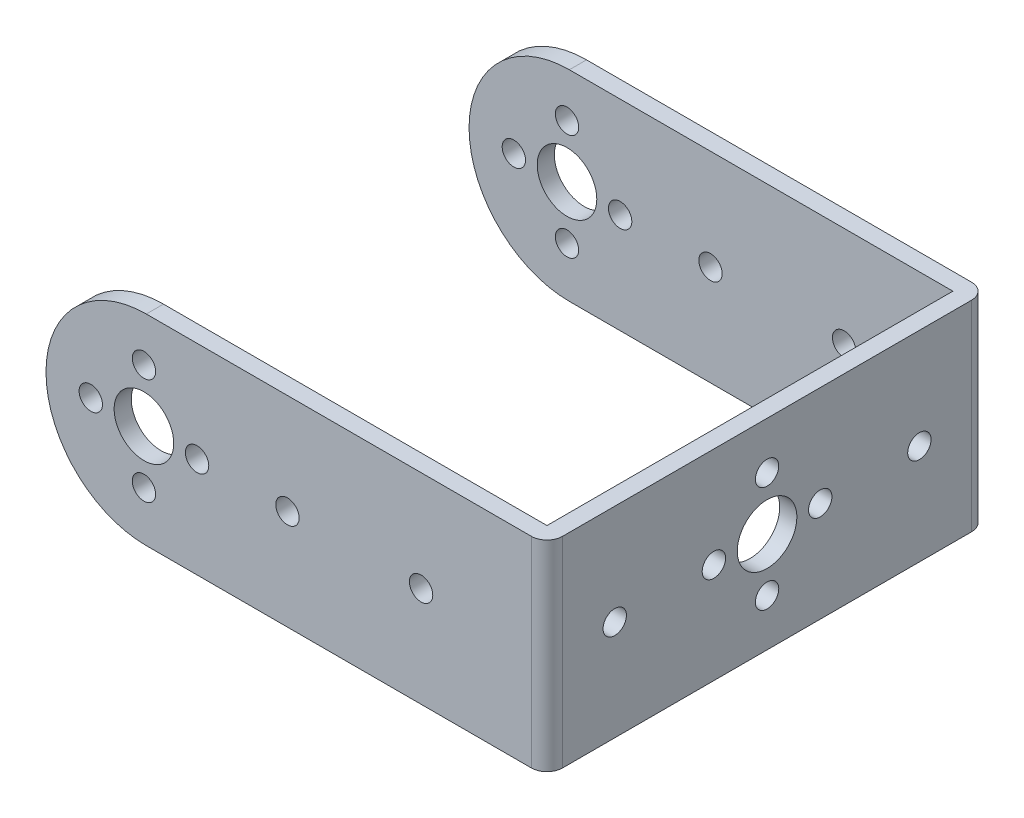
ISO-10303-21;
HEADER;
FILE_DESCRIPTION(('STEP AP214'),'2;1');
FILE_NAME('part.step','',(''),(''),'','','');
FILE_SCHEMA(('AUTOMOTIVE_DESIGN { 1 0 10303 214 1 1 1 1 }'));
ENDSEC;
DATA;
#1=APPLICATION_CONTEXT('core data for automotive mechanical design processes');
#2=APPLICATION_PROTOCOL_DEFINITION('international standard','automotive_design',2000,#1);
#3=PRODUCT_CONTEXT('',#1,'mechanical');
#4=PRODUCT('Part','Part','',(#3));
#5=PRODUCT_RELATED_PRODUCT_CATEGORY('part','',(#4));
#6=PRODUCT_DEFINITION_FORMATION('','',#4);
#7=PRODUCT_DEFINITION_CONTEXT('part definition',#1,'design');
#8=PRODUCT_DEFINITION('design','',#6,#7);
#9=PRODUCT_DEFINITION_SHAPE('','',#8);
#10=(LENGTH_UNIT() NAMED_UNIT(*) SI_UNIT(.MILLI.,.METRE.));
#11=(NAMED_UNIT(*) PLANE_ANGLE_UNIT() SI_UNIT($,.RADIAN.));
#12=(NAMED_UNIT(*) SI_UNIT($,.STERADIAN.) SOLID_ANGLE_UNIT());
#13=UNCERTAINTY_MEASURE_WITH_UNIT(LENGTH_MEASURE(1.E-05),#10,'distance_accuracy_value','');
#14=(GEOMETRIC_REPRESENTATION_CONTEXT(3) GLOBAL_UNCERTAINTY_ASSIGNED_CONTEXT((#13)) GLOBAL_UNIT_ASSIGNED_CONTEXT((#10,
#11,#12)) REPRESENTATION_CONTEXT('',''));
#15=CARTESIAN_POINT('',(0.,0.,0.));
#16=DIRECTION('',(0.,0.,1.));
#17=DIRECTION('',(1.,0.,0.));
#18=AXIS2_PLACEMENT_3D('',#15,#16,#17);
#19=CARTESIAN_POINT('',(32.15,12.875,0.));
#20=DIRECTION('',(0.,0.,1.));
#21=DIRECTION('',(1.,0.,0.));
#22=AXIS2_PLACEMENT_3D('',#19,#20,#21);
#23=PLANE('',#22);
#24=CARTESIAN_POINT('',(12.5704196521559,13.1250015369662,0.));
#25=DIRECTION('',(0.,0.,-1.));
#26=DIRECTION('',(-1.,0.,0.));
#27=AXIS2_PLACEMENT_3D('',#24,#25,#26);
#28=CIRCLE('',#27,3.825);
#29=CARTESIAN_POINT('',(16.3954196521559,13.1250015369662,0.));
#30=VERTEX_POINT('',#29);
#31=EDGE_CURVE('E386',#30,#30,#28,.T.);
#32=ORIENTED_EDGE('',*,*,#31,.F.);
#33=EDGE_LOOP('',(#32));
#34=FACE_BOUND('',#33,.T.);
#35=CARTESIAN_POINT('',(12.575,19.95,0.));
#36=DIRECTION('',(0.,0.,-1.));
#37=DIRECTION('',(-1.,0.,0.));
#38=AXIS2_PLACEMENT_3D('',#35,#36,#37);
#39=CIRCLE('',#38,1.5);
#40=CARTESIAN_POINT('',(14.075,19.95,0.));
#41=VERTEX_POINT('',#40);
#42=EDGE_CURVE('E488',#41,#41,#39,.T.);
#43=ORIENTED_EDGE('',*,*,#42,.F.);
#44=EDGE_LOOP('',(#43));
#45=FACE_BOUND('',#44,.T.);
#46=CARTESIAN_POINT('',(5.75,12.875,0.));
#47=DIRECTION('',(0.,0.,-1.));
#48=DIRECTION('',(-1.,0.,0.));
#49=AXIS2_PLACEMENT_3D('',#46,#47,#48);
#50=CIRCLE('',#49,1.5);
#51=CARTESIAN_POINT('',(7.25,12.875,0.));
#52=VERTEX_POINT('',#51);
#53=EDGE_CURVE('E311',#52,#52,#50,.T.);
#54=ORIENTED_EDGE('',*,*,#53,.F.);
#55=EDGE_LOOP('',(#54));
#56=FACE_BOUND('',#55,.T.);
#57=CARTESIAN_POINT('',(12.5704196521559,6.30000153696623,0.));
#58=DIRECTION('',(0.,0.,-1.));
#59=DIRECTION('',(-1.,0.,0.));
#60=AXIS2_PLACEMENT_3D('',#57,#58,#59);
#61=CIRCLE('',#60,1.5);
#62=CARTESIAN_POINT('',(14.0704196521559,6.30000153696623,0.));
#63=VERTEX_POINT('',#62);
#64=EDGE_CURVE('E338',#63,#63,#61,.T.);
#65=ORIENTED_EDGE('',*,*,#64,.F.);
#66=EDGE_LOOP('',(#65));
#67=FACE_BOUND('',#66,.T.);
#68=CARTESIAN_POINT('',(48.1408393043118,12.875,0.));
#69=DIRECTION('',(0.,0.,-1.));
#70=DIRECTION('',(-1.,0.,0.));
#71=AXIS2_PLACEMENT_3D('',#68,#69,#70);
#72=CIRCLE('',#71,1.5);
#73=CARTESIAN_POINT('',(49.6408393043118,12.875,0.));
#74=VERTEX_POINT('',#73);
#75=EDGE_CURVE('E337',#74,#74,#72,.T.);
#76=ORIENTED_EDGE('',*,*,#75,.F.);
#77=EDGE_LOOP('',(#76));
#78=FACE_BOUND('',#77,.T.);
#79=CARTESIAN_POINT('',(30.9908393043118,12.875,0.));
#80=DIRECTION('',(0.,0.,-1.));
#81=DIRECTION('',(-1.,0.,0.));
#82=AXIS2_PLACEMENT_3D('',#79,#80,#81);
#83=CIRCLE('',#82,1.5);
#84=CARTESIAN_POINT('',(32.4908393043118,12.875,0.));
#85=VERTEX_POINT('',#84);
#86=EDGE_CURVE('E432',#85,#85,#83,.T.);
#87=ORIENTED_EDGE('',*,*,#86,.F.);
#88=EDGE_LOOP('',(#87));
#89=FACE_BOUND('',#88,.T.);
#90=CARTESIAN_POINT('',(19.3908393043118,12.875,0.));
#91=DIRECTION('',(0.,0.,-1.));
#92=DIRECTION('',(-1.,0.,0.));
#93=AXIS2_PLACEMENT_3D('',#90,#91,#92);
#94=CIRCLE('',#93,1.5);
#95=CARTESIAN_POINT('',(20.8908393043118,12.875,0.));
#96=VERTEX_POINT('',#95);
#97=EDGE_CURVE('E323',#96,#96,#94,.T.);
#98=ORIENTED_EDGE('',*,*,#97,.F.);
#99=EDGE_LOOP('',(#98));
#100=FACE_BOUND('',#99,.T.);
#101=DIRECTION('',(0.,1.,0.));
#102=VECTOR('',#101,1.);
#103=CARTESIAN_POINT('',(62.3,6.4375,0.));
#104=LINE('',#103,#102);
#105=CARTESIAN_POINT('',(62.3,0.,0.));
#106=VERTEX_POINT('',#105);
#107=CARTESIAN_POINT('',(62.3,25.75,0.));
#108=VERTEX_POINT('',#107);
#109=EDGE_CURVE('E347',#106,#108,#104,.T.);
#110=ORIENTED_EDGE('',*,*,#109,.F.);
#111=DIRECTION('',(1.,0.,0.));
#112=VECTOR('',#111,1.);
#113=CARTESIAN_POINT('',(12.875,0.,0.));
#114=LINE('',#113,#112);
#115=CARTESIAN_POINT('',(12.875,0.,0.));
#116=VERTEX_POINT('',#115);
#117=EDGE_CURVE('E27',#116,#106,#114,.T.);
#118=ORIENTED_EDGE('',*,*,#117,.F.);
#119=CARTESIAN_POINT('',(12.875,12.875,0.));
#120=DIRECTION('',(0.,0.,1.));
#121=DIRECTION('',(0.,1.,0.));
#122=AXIS2_PLACEMENT_3D('',#119,#120,#121);
#123=CIRCLE('',#122,12.875);
#124=CARTESIAN_POINT('',(12.875,25.75,0.));
#125=VERTEX_POINT('',#124);
#126=EDGE_CURVE('E10',#125,#116,#123,.T.);
#127=ORIENTED_EDGE('',*,*,#126,.F.);
#128=DIRECTION('',(-1.,0.,0.));
#129=VECTOR('',#128,1.);
#130=CARTESIAN_POINT('',(64.3,25.75,0.));
#131=LINE('',#130,#129);
#132=EDGE_CURVE('E437',#108,#125,#131,.T.);
#133=ORIENTED_EDGE('',*,*,#132,.F.);
#134=EDGE_LOOP('',(#110,#118,#127,#133));
#135=FACE_BOUND('',#134,.T.);
#136=ADVANCED_FACE('F16',(#34,#45,#56,#67,#78,#89,#100,#135),#23,.F.);
#137=CARTESIAN_POINT('',(12.875,12.875,0.));
#138=DIRECTION('',(0.,0.,1.));
#139=DIRECTION('',(0.,1.,0.));
#140=AXIS2_PLACEMENT_3D('',#137,#138,#139);
#141=CYLINDRICAL_SURFACE('',#140,12.875);
#142=ORIENTED_EDGE('',*,*,#126,.T.);
#143=DIRECTION('',(0.,0.,1.));
#144=VECTOR('',#143,1.);
#145=CARTESIAN_POINT('',(12.875,0.,0.));
#146=LINE('',#145,#144);
#147=CARTESIAN_POINT('',(12.875,0.,2.2));
#148=VERTEX_POINT('',#147);
#149=EDGE_CURVE('E326',#116,#148,#146,.T.);
#150=ORIENTED_EDGE('',*,*,#149,.T.);
#151=CARTESIAN_POINT('',(12.875,12.875,2.2));
#152=DIRECTION('',(0.,0.,1.));
#153=DIRECTION('',(0.,1.,0.));
#154=AXIS2_PLACEMENT_3D('',#151,#152,#153);
#155=CIRCLE('',#154,12.875);
#156=CARTESIAN_POINT('',(12.875,25.75,2.2));
#157=VERTEX_POINT('',#156);
#158=EDGE_CURVE('E322',#157,#148,#155,.T.);
#159=ORIENTED_EDGE('',*,*,#158,.F.);
#160=DIRECTION('',(0.,0.,1.));
#161=VECTOR('',#160,1.);
#162=CARTESIAN_POINT('',(12.875,25.75,0.));
#163=LINE('',#162,#161);
#164=EDGE_CURVE('E356',#125,#157,#163,.T.);
#165=ORIENTED_EDGE('',*,*,#164,.F.);
#166=EDGE_LOOP('',(#142,#150,#159,#165));
#167=FACE_BOUND('',#166,.T.);
#168=ADVANCED_FACE('F597',(#167),#141,.T.);
#169=CARTESIAN_POINT('',(12.875,0.,0.));
#170=DIRECTION('',(0.,-1.,0.));
#171=DIRECTION('',(-1.,0.,0.));
#172=AXIS2_PLACEMENT_3D('',#169,#170,#171);
#173=PLANE('',#172);
#174=CARTESIAN_POINT('',(62.3,0.,54.5));
#175=DIRECTION('',(0.,1.,0.));
#176=DIRECTION('',(0.707106781186548,0.,0.707106781186548));
#177=AXIS2_PLACEMENT_3D('',#174,#175,#176);
#178=CIRCLE('',#177,2.);
#179=CARTESIAN_POINT('',(62.3,0.,56.5));
#180=VERTEX_POINT('',#179);
#181=CARTESIAN_POINT('',(64.3,0.,54.5));
#182=VERTEX_POINT('',#181);
#183=EDGE_CURVE('E276',#180,#182,#178,.T.);
#184=ORIENTED_EDGE('',*,*,#183,.F.);
#185=DIRECTION('',(1.,0.,0.));
#186=VECTOR('',#185,1.);
#187=CARTESIAN_POINT('',(12.875,0.,56.5));
#188=LINE('',#187,#186);
#189=CARTESIAN_POINT('',(12.875,0.,56.5));
#190=VERTEX_POINT('',#189);
#191=EDGE_CURVE('E309',#190,#180,#188,.T.);
#192=ORIENTED_EDGE('',*,*,#191,.F.);
#193=DIRECTION('',(0.,0.,-1.));
#194=VECTOR('',#193,1.);
#195=CARTESIAN_POINT('',(12.875,0.,56.5));
#196=LINE('',#195,#194);
#197=CARTESIAN_POINT('',(12.875,0.,54.3));
#198=VERTEX_POINT('',#197);
#199=EDGE_CURVE('E372',#190,#198,#196,.T.);
#200=ORIENTED_EDGE('',*,*,#199,.T.);
#201=DIRECTION('',(1.,0.,0.));
#202=VECTOR('',#201,1.);
#203=CARTESIAN_POINT('',(12.875,0.,54.3));
#204=LINE('',#203,#202);
#205=CARTESIAN_POINT('',(62.1,0.,54.3));
#206=VERTEX_POINT('',#205);
#207=EDGE_CURVE('E305',#198,#206,#204,.T.);
#208=ORIENTED_EDGE('',*,*,#207,.T.);
#209=DIRECTION('',(0.,0.,1.));
#210=VECTOR('',#209,1.);
#211=CARTESIAN_POINT('',(62.1,0.,2.2));
#212=LINE('',#211,#210);
#213=CARTESIAN_POINT('',(62.1,0.,2.2));
#214=VERTEX_POINT('',#213);
#215=EDGE_CURVE('E292',#214,#206,#212,.T.);
#216=ORIENTED_EDGE('',*,*,#215,.F.);
#217=DIRECTION('',(1.,0.,0.));
#218=VECTOR('',#217,1.);
#219=CARTESIAN_POINT('',(12.875,0.,2.2));
#220=LINE('',#219,#218);
#221=EDGE_CURVE('E383',#148,#214,#220,.T.);
#222=ORIENTED_EDGE('',*,*,#221,.F.);
#223=ORIENTED_EDGE('',*,*,#149,.F.);
#224=ORIENTED_EDGE('',*,*,#117,.T.);
#225=CARTESIAN_POINT('',(62.3,0.,2.));
#226=DIRECTION('',(0.,1.,0.));
#227=DIRECTION('',(0.707106781186546,0.,-0.707106781186549));
#228=AXIS2_PLACEMENT_3D('',#225,#226,#227);
#229=CIRCLE('',#228,2.);
#230=CARTESIAN_POINT('',(64.3,0.,2.));
#231=VERTEX_POINT('',#230);
#232=EDGE_CURVE('E287',#231,#106,#229,.T.);
#233=ORIENTED_EDGE('',*,*,#232,.F.);
#234=DIRECTION('',(0.,0.,1.));
#235=VECTOR('',#234,1.);
#236=CARTESIAN_POINT('',(64.3,0.,0.));
#237=LINE('',#236,#235);
#238=EDGE_CURVE('E417',#231,#182,#237,.T.);
#239=ORIENTED_EDGE('',*,*,#238,.T.);
#240=EDGE_LOOP('',(#184,#192,#200,#208,#216,#222,#223,#224,#233,#239));
#241=FACE_BOUND('',#240,.T.);
#242=ADVANCED_FACE('F613',(#241),#173,.T.);
#243=CARTESIAN_POINT('',(19.3908393043118,12.875,0.));
#244=DIRECTION('',(0.,0.,1.));
#245=DIRECTION('',(-1.,0.,0.));
#246=AXIS2_PLACEMENT_3D('',#243,#244,#245);
#247=CYLINDRICAL_SURFACE('',#246,1.5);
#248=CARTESIAN_POINT('',(19.3908393043118,12.875,2.2));
#249=DIRECTION('',(0.,0.,-1.));
#250=DIRECTION('',(-1.,0.,0.));
#251=AXIS2_PLACEMENT_3D('',#248,#249,#250);
#252=CIRCLE('',#251,1.5);
#253=CARTESIAN_POINT('',(20.8908393043118,12.875,2.2));
#254=VERTEX_POINT('',#253);
#255=EDGE_CURVE('E478',#254,#254,#252,.T.);
#256=ORIENTED_EDGE('',*,*,#255,.F.);
#257=DIRECTION('',(0.,0.,-1.));
#258=VECTOR('',#257,1.);
#259=CARTESIAN_POINT('',(20.8908393043118,12.875,0.));
#260=LINE('',#259,#258);
#261=EDGE_CURVE('E327',#254,#96,#260,.T.);
#262=ORIENTED_EDGE('',*,*,#261,.T.);
#263=ORIENTED_EDGE('',*,*,#97,.T.);
#264=ORIENTED_EDGE('',*,*,#261,.F.);
#265=EDGE_LOOP('',(#256,#262,#263,#264));
#266=FACE_BOUND('',#265,.T.);
#267=ADVANCED_FACE('F823',(#266),#247,.F.);
#268=CARTESIAN_POINT('',(30.9908393043118,12.875,0.));
#269=DIRECTION('',(0.,0.,1.));
#270=DIRECTION('',(-1.,0.,0.));
#271=AXIS2_PLACEMENT_3D('',#268,#269,#270);
#272=CYLINDRICAL_SURFACE('',#271,1.5);
#273=CARTESIAN_POINT('',(30.9908393043118,12.875,2.2));
#274=DIRECTION('',(0.,0.,-1.));
#275=DIRECTION('',(-1.,0.,0.));
#276=AXIS2_PLACEMENT_3D('',#273,#274,#275);
#277=CIRCLE('',#276,1.5);
#278=CARTESIAN_POINT('',(32.4908393043118,12.875,2.2));
#279=VERTEX_POINT('',#278);
#280=EDGE_CURVE('E381',#279,#279,#277,.T.);
#281=ORIENTED_EDGE('',*,*,#280,.F.);
#282=DIRECTION('',(0.,0.,-1.));
#283=VECTOR('',#282,1.);
#284=CARTESIAN_POINT('',(32.4908393043118,12.875,0.));
#285=LINE('',#284,#283);
#286=EDGE_CURVE('E428',#279,#85,#285,.T.);
#287=ORIENTED_EDGE('',*,*,#286,.T.);
#288=ORIENTED_EDGE('',*,*,#86,.T.);
#289=ORIENTED_EDGE('',*,*,#286,.F.);
#290=EDGE_LOOP('',(#281,#287,#288,#289));
#291=FACE_BOUND('',#290,.T.);
#292=ADVANCED_FACE('F592',(#291),#272,.F.);
#293=CARTESIAN_POINT('',(48.1408393043118,12.875,0.));
#294=DIRECTION('',(0.,0.,1.));
#295=DIRECTION('',(-1.,0.,0.));
#296=AXIS2_PLACEMENT_3D('',#293,#294,#295);
#297=CYLINDRICAL_SURFACE('',#296,1.5);
#298=CARTESIAN_POINT('',(48.1408393043118,12.875,2.2));
#299=DIRECTION('',(0.,0.,-1.));
#300=DIRECTION('',(-1.,0.,0.));
#301=AXIS2_PLACEMENT_3D('',#298,#299,#300);
#302=CIRCLE('',#301,1.5);
#303=CARTESIAN_POINT('',(49.6408393043118,12.875,2.2));
#304=VERTEX_POINT('',#303);
#305=EDGE_CURVE('E377',#304,#304,#302,.T.);
#306=ORIENTED_EDGE('',*,*,#305,.F.);
#307=DIRECTION('',(0.,0.,-1.));
#308=VECTOR('',#307,1.);
#309=CARTESIAN_POINT('',(49.6408393043118,12.875,0.));
#310=LINE('',#309,#308);
#311=EDGE_CURVE('E333',#304,#74,#310,.T.);
#312=ORIENTED_EDGE('',*,*,#311,.T.);
#313=ORIENTED_EDGE('',*,*,#75,.T.);
#314=ORIENTED_EDGE('',*,*,#311,.F.);
#315=EDGE_LOOP('',(#306,#312,#313,#314));
#316=FACE_BOUND('',#315,.T.);
#317=ADVANCED_FACE('F835',(#316),#297,.F.);
#318=CARTESIAN_POINT('',(12.5704196521559,6.30000153696623,0.));
#319=DIRECTION('',(0.,0.,1.));
#320=DIRECTION('',(-1.,0.,0.));
#321=AXIS2_PLACEMENT_3D('',#318,#319,#320);
#322=CYLINDRICAL_SURFACE('',#321,1.5);
#323=CARTESIAN_POINT('',(12.5704196521559,6.30000153696623,2.2));
#324=DIRECTION('',(0.,0.,-1.));
#325=DIRECTION('',(-1.,0.,0.));
#326=AXIS2_PLACEMENT_3D('',#323,#324,#325);
#327=CIRCLE('',#326,1.5);
#328=CARTESIAN_POINT('',(14.0704196521559,6.30000153696623,2.2));
#329=VERTEX_POINT('',#328);
#330=EDGE_CURVE('E382',#329,#329,#327,.T.);
#331=ORIENTED_EDGE('',*,*,#330,.F.);
#332=DIRECTION('',(0.,0.,-1.));
#333=VECTOR('',#332,1.);
#334=CARTESIAN_POINT('',(14.0704196521559,6.30000153696623,0.));
#335=LINE('',#334,#333);
#336=EDGE_CURVE('E315',#329,#63,#335,.T.);
#337=ORIENTED_EDGE('',*,*,#336,.T.);
#338=ORIENTED_EDGE('',*,*,#64,.T.);
#339=ORIENTED_EDGE('',*,*,#336,.F.);
#340=EDGE_LOOP('',(#331,#337,#338,#339));
#341=FACE_BOUND('',#340,.T.);
#342=ADVANCED_FACE('F522',(#341),#322,.F.);
#343=CARTESIAN_POINT('',(5.75,12.875,0.));
#344=DIRECTION('',(0.,0.,1.));
#345=DIRECTION('',(-1.,0.,0.));
#346=AXIS2_PLACEMENT_3D('',#343,#344,#345);
#347=CYLINDRICAL_SURFACE('',#346,1.5);
#348=CARTESIAN_POINT('',(5.75,12.875,2.2));
#349=DIRECTION('',(0.,0.,-1.));
#350=DIRECTION('',(-1.,0.,0.));
#351=AXIS2_PLACEMENT_3D('',#348,#349,#350);
#352=CIRCLE('',#351,1.5);
#353=CARTESIAN_POINT('',(7.25,12.875,2.2));
#354=VERTEX_POINT('',#353);
#355=EDGE_CURVE('E298',#354,#354,#352,.T.);
#356=ORIENTED_EDGE('',*,*,#355,.F.);
#357=DIRECTION('',(0.,0.,-1.));
#358=VECTOR('',#357,1.);
#359=CARTESIAN_POINT('',(7.25,12.875,0.));
#360=LINE('',#359,#358);
#361=EDGE_CURVE('E316',#354,#52,#360,.T.);
#362=ORIENTED_EDGE('',*,*,#361,.T.);
#363=ORIENTED_EDGE('',*,*,#53,.T.);
#364=ORIENTED_EDGE('',*,*,#361,.F.);
#365=EDGE_LOOP('',(#356,#362,#363,#364));
#366=FACE_BOUND('',#365,.T.);
#367=ADVANCED_FACE('F867',(#366),#347,.F.);
#368=CARTESIAN_POINT('',(12.575,19.95,0.));
#369=DIRECTION('',(0.,0.,1.));
#370=DIRECTION('',(-1.,0.,0.));
#371=AXIS2_PLACEMENT_3D('',#368,#369,#370);
#372=CYLINDRICAL_SURFACE('',#371,1.5);
#373=CARTESIAN_POINT('',(12.575,19.95,2.2));
#374=DIRECTION('',(0.,0.,-1.));
#375=DIRECTION('',(-1.,0.,0.));
#376=AXIS2_PLACEMENT_3D('',#373,#374,#375);
#377=CIRCLE('',#376,1.5);
#378=CARTESIAN_POINT('',(14.075,19.95,2.2));
#379=VERTEX_POINT('',#378);
#380=EDGE_CURVE('E294',#379,#379,#377,.T.);
#381=ORIENTED_EDGE('',*,*,#380,.F.);
#382=DIRECTION('',(0.,0.,-1.));
#383=VECTOR('',#382,1.);
#384=CARTESIAN_POINT('',(14.075,19.95,0.));
#385=LINE('',#384,#383);
#386=EDGE_CURVE('E389',#379,#41,#385,.T.);
#387=ORIENTED_EDGE('',*,*,#386,.T.);
#388=ORIENTED_EDGE('',*,*,#42,.T.);
#389=ORIENTED_EDGE('',*,*,#386,.F.);
#390=EDGE_LOOP('',(#381,#387,#388,#389));
#391=FACE_BOUND('',#390,.T.);
#392=ADVANCED_FACE('F18',(#391),#372,.F.);
#393=CARTESIAN_POINT('',(12.5704196521559,13.1250015369662,0.));
#394=DIRECTION('',(0.,0.,1.));
#395=DIRECTION('',(-1.,0.,0.));
#396=AXIS2_PLACEMENT_3D('',#393,#394,#395);
#397=CYLINDRICAL_SURFACE('',#396,3.825);
#398=CARTESIAN_POINT('',(12.5704196521559,13.1250015369662,2.2));
#399=DIRECTION('',(0.,0.,-1.));
#400=DIRECTION('',(-1.,0.,0.));
#401=AXIS2_PLACEMENT_3D('',#398,#399,#400);
#402=CIRCLE('',#401,3.825);
#403=CARTESIAN_POINT('',(16.3954196521559,13.1250015369662,2.2));
#404=VERTEX_POINT('',#403);
#405=EDGE_CURVE('E299',#404,#404,#402,.T.);
#406=ORIENTED_EDGE('',*,*,#405,.F.);
#407=DIRECTION('',(0.,0.,-1.));
#408=VECTOR('',#407,1.);
#409=CARTESIAN_POINT('',(16.3954196521559,13.1250015369662,0.));
#410=LINE('',#409,#408);
#411=EDGE_CURVE('E20',#404,#30,#410,.T.);
#412=ORIENTED_EDGE('',*,*,#411,.T.);
#413=ORIENTED_EDGE('',*,*,#31,.T.);
#414=ORIENTED_EDGE('',*,*,#411,.F.);
#415=EDGE_LOOP('',(#406,#412,#413,#414));
#416=FACE_BOUND('',#415,.T.);
#417=ADVANCED_FACE('F760',(#416),#397,.F.);
#418=CARTESIAN_POINT('',(32.15,12.875,2.2));
#419=DIRECTION('',(0.,0.,1.));
#420=DIRECTION('',(1.,0.,0.));
#421=AXIS2_PLACEMENT_3D('',#418,#419,#420);
#422=PLANE('',#421);
#423=ORIENTED_EDGE('',*,*,#255,.T.);
#424=EDGE_LOOP('',(#423));
#425=FACE_BOUND('',#424,.T.);
#426=ORIENTED_EDGE('',*,*,#280,.T.);
#427=EDGE_LOOP('',(#426));
#428=FACE_BOUND('',#427,.T.);
#429=ORIENTED_EDGE('',*,*,#305,.T.);
#430=EDGE_LOOP('',(#429));
#431=FACE_BOUND('',#430,.T.);
#432=ORIENTED_EDGE('',*,*,#330,.T.);
#433=EDGE_LOOP('',(#432));
#434=FACE_BOUND('',#433,.T.);
#435=ORIENTED_EDGE('',*,*,#355,.T.);
#436=EDGE_LOOP('',(#435));
#437=FACE_BOUND('',#436,.T.);
#438=ORIENTED_EDGE('',*,*,#380,.T.);
#439=EDGE_LOOP('',(#438));
#440=FACE_BOUND('',#439,.T.);
#441=ORIENTED_EDGE('',*,*,#405,.T.);
#442=EDGE_LOOP('',(#441));
#443=FACE_BOUND('',#442,.T.);
#444=DIRECTION('',(0.,1.,0.));
#445=VECTOR('',#444,1.);
#446=CARTESIAN_POINT('',(62.1,19.3125,2.2));
#447=LINE('',#446,#445);
#448=CARTESIAN_POINT('',(62.1,25.75,2.2));
#449=VERTEX_POINT('',#448);
#450=EDGE_CURVE('E289',#214,#449,#447,.T.);
#451=ORIENTED_EDGE('',*,*,#450,.T.);
#452=DIRECTION('',(-1.,0.,0.));
#453=VECTOR('',#452,1.);
#454=CARTESIAN_POINT('',(64.3,25.75,2.2));
#455=LINE('',#454,#453);
#456=EDGE_CURVE('E351',#449,#157,#455,.T.);
#457=ORIENTED_EDGE('',*,*,#456,.T.);
#458=ORIENTED_EDGE('',*,*,#158,.T.);
#459=ORIENTED_EDGE('',*,*,#221,.T.);
#460=EDGE_LOOP('',(#451,#457,#458,#459));
#461=FACE_BOUND('',#460,.T.);
#462=ADVANCED_FACE('F529',(#425,#428,#431,#434,#437,#440,#443,#461),#422,.T.);
#463=CARTESIAN_POINT('',(62.1,25.75,2.2));
#464=DIRECTION('',(-1.,0.,0.));
#465=DIRECTION('',(0.,0.,1.));
#466=AXIS2_PLACEMENT_3D('',#463,#464,#465);
#467=PLANE('',#466);
#468=CARTESIAN_POINT('',(62.1,12.875,8.7));
#469=DIRECTION('',(1.,0.,0.));
#470=DIRECTION('',(0.,0.,1.));
#471=AXIS2_PLACEMENT_3D('',#468,#469,#470);
#472=CIRCLE('',#471,1.5);
#473=CARTESIAN_POINT('',(62.1,12.875,7.2));
#474=VERTEX_POINT('',#473);
#475=EDGE_CURVE('E342',#474,#474,#472,.T.);
#476=ORIENTED_EDGE('',*,*,#475,.T.);
#477=EDGE_LOOP('',(#476));
#478=FACE_BOUND('',#477,.T.);
#479=CARTESIAN_POINT('',(62.1,12.875,35.075));
#480=DIRECTION('',(1.,0.,0.));
#481=DIRECTION('',(0.,0.,1.));
#482=AXIS2_PLACEMENT_3D('',#479,#480,#481);
#483=CIRCLE('',#482,1.5);
#484=CARTESIAN_POINT('',(62.1,12.875,33.575));
#485=VERTEX_POINT('',#484);
#486=EDGE_CURVE('E461',#485,#485,#483,.T.);
#487=ORIENTED_EDGE('',*,*,#486,.T.);
#488=EDGE_LOOP('',(#487));
#489=FACE_BOUND('',#488,.T.);
#490=CARTESIAN_POINT('',(62.1,12.875,47.8));
#491=DIRECTION('',(1.,0.,0.));
#492=DIRECTION('',(0.,0.,1.));
#493=AXIS2_PLACEMENT_3D('',#490,#491,#492);
#494=CIRCLE('',#493,1.5);
#495=CARTESIAN_POINT('',(62.1,12.875,46.3));
#496=VERTEX_POINT('',#495);
#497=EDGE_CURVE('E399',#496,#496,#494,.T.);
#498=ORIENTED_EDGE('',*,*,#497,.T.);
#499=EDGE_LOOP('',(#498));
#500=FACE_BOUND('',#499,.T.);
#501=CARTESIAN_POINT('',(62.1,12.875,21.425));
#502=DIRECTION('',(1.,0.,0.));
#503=DIRECTION('',(0.,0.,1.));
#504=AXIS2_PLACEMENT_3D('',#501,#502,#503);
#505=CIRCLE('',#504,1.5);
#506=CARTESIAN_POINT('',(62.1,12.875,19.925));
#507=VERTEX_POINT('',#506);
#508=EDGE_CURVE('E304',#507,#507,#505,.T.);
#509=ORIENTED_EDGE('',*,*,#508,.T.);
#510=EDGE_LOOP('',(#509));
#511=FACE_BOUND('',#510,.T.);
#512=CARTESIAN_POINT('',(62.1,19.7,28.25));
#513=DIRECTION('',(1.,0.,0.));
#514=DIRECTION('',(0.,0.,1.));
#515=AXIS2_PLACEMENT_3D('',#512,#513,#514);
#516=CIRCLE('',#515,1.5);
#517=CARTESIAN_POINT('',(62.1,19.7,26.75));
#518=VERTEX_POINT('',#517);
#519=EDGE_CURVE('E261',#518,#518,#516,.T.);
#520=ORIENTED_EDGE('',*,*,#519,.T.);
#521=EDGE_LOOP('',(#520));
#522=FACE_BOUND('',#521,.T.);
#523=CARTESIAN_POINT('',(62.1,6.05,28.25));
#524=DIRECTION('',(1.,0.,0.));
#525=DIRECTION('',(0.,0.,1.));
#526=AXIS2_PLACEMENT_3D('',#523,#524,#525);
#527=CIRCLE('',#526,1.5);
#528=CARTESIAN_POINT('',(62.1,6.05,26.75));
#529=VERTEX_POINT('',#528);
#530=EDGE_CURVE('E257',#529,#529,#527,.T.);
#531=ORIENTED_EDGE('',*,*,#530,.T.);
#532=EDGE_LOOP('',(#531));
#533=FACE_BOUND('',#532,.T.);
#534=CARTESIAN_POINT('',(62.1,12.875,28.25));
#535=DIRECTION('',(1.,0.,0.));
#536=DIRECTION('',(0.,0.,1.));
#537=AXIS2_PLACEMENT_3D('',#534,#535,#536);
#538=CIRCLE('',#537,3.825);
#539=CARTESIAN_POINT('',(62.1,12.875,24.425));
#540=VERTEX_POINT('',#539);
#541=EDGE_CURVE('E272',#540,#540,#538,.T.);
#542=ORIENTED_EDGE('',*,*,#541,.T.);
#543=EDGE_LOOP('',(#542));
#544=FACE_BOUND('',#543,.T.);
#545=ORIENTED_EDGE('',*,*,#450,.F.);
#546=ORIENTED_EDGE('',*,*,#215,.T.);
#547=DIRECTION('',(0.,-1.,0.));
#548=VECTOR('',#547,1.);
#549=CARTESIAN_POINT('',(62.1,25.75,54.3));
#550=LINE('',#549,#548);
#551=CARTESIAN_POINT('',(62.1,25.75,54.3));
#552=VERTEX_POINT('',#551);
#553=EDGE_CURVE('E310',#552,#206,#550,.T.);
#554=ORIENTED_EDGE('',*,*,#553,.F.);
#555=DIRECTION('',(0.,0.,1.));
#556=VECTOR('',#555,1.);
#557=CARTESIAN_POINT('',(62.1,25.75,2.2));
#558=LINE('',#557,#556);
#559=EDGE_CURVE('E355',#449,#552,#558,.T.);
#560=ORIENTED_EDGE('',*,*,#559,.F.);
#561=EDGE_LOOP('',(#545,#546,#554,#560));
#562=FACE_BOUND('',#561,.T.);
#563=ADVANCED_FACE('F264',(#478,#489,#500,#511,#522,#533,#544,#562),#467,.T.);
#564=CARTESIAN_POINT('',(62.1,12.875,8.7));
#565=DIRECTION('',(1.,0.,0.));
#566=DIRECTION('',(0.,0.,1.));
#567=AXIS2_PLACEMENT_3D('',#564,#565,#566);
#568=CYLINDRICAL_SURFACE('',#567,1.5);
#569=ORIENTED_EDGE('',*,*,#475,.F.);
#570=DIRECTION('',(1.,0.,0.));
#571=VECTOR('',#570,1.);
#572=CARTESIAN_POINT('',(62.1,12.875,7.2));
#573=LINE('',#572,#571);
#574=CARTESIAN_POINT('',(64.3,12.875,7.2));
#575=VERTEX_POINT('',#574);
#576=EDGE_CURVE('E293',#474,#575,#573,.T.);
#577=ORIENTED_EDGE('',*,*,#576,.T.);
#578=CARTESIAN_POINT('',(64.3,12.875,8.7));
#579=DIRECTION('',(-1.,0.,0.));
#580=DIRECTION('',(0.,0.,1.));
#581=AXIS2_PLACEMENT_3D('',#578,#579,#580);
#582=CIRCLE('',#581,1.5);
#583=EDGE_CURVE('E283',#575,#575,#582,.T.);
#584=ORIENTED_EDGE('',*,*,#583,.F.);
#585=ORIENTED_EDGE('',*,*,#576,.F.);
#586=EDGE_LOOP('',(#569,#577,#584,#585));
#587=FACE_BOUND('',#586,.T.);
#588=ADVANCED_FACE('F767',(#587),#568,.F.);
#589=CARTESIAN_POINT('',(62.1,12.875,35.075));
#590=DIRECTION('',(1.,0.,0.));
#591=DIRECTION('',(0.,0.,1.));
#592=AXIS2_PLACEMENT_3D('',#589,#590,#591);
#593=CYLINDRICAL_SURFACE('',#592,1.5);
#594=ORIENTED_EDGE('',*,*,#486,.F.);
#595=DIRECTION('',(1.,0.,0.));
#596=VECTOR('',#595,1.);
#597=CARTESIAN_POINT('',(62.1,12.875,33.575));
#598=LINE('',#597,#596);
#599=CARTESIAN_POINT('',(64.3,12.875,33.575));
#600=VERTEX_POINT('',#599);
#601=EDGE_CURVE('E346',#485,#600,#598,.T.);
#602=ORIENTED_EDGE('',*,*,#601,.T.);
#603=CARTESIAN_POINT('',(64.3,12.875,35.075));
#604=DIRECTION('',(-1.,0.,0.));
#605=DIRECTION('',(0.,0.,1.));
#606=AXIS2_PLACEMENT_3D('',#603,#604,#605);
#607=CIRCLE('',#606,1.5);
#608=EDGE_CURVE('E288',#600,#600,#607,.T.);
#609=ORIENTED_EDGE('',*,*,#608,.F.);
#610=ORIENTED_EDGE('',*,*,#601,.F.);
#611=EDGE_LOOP('',(#594,#602,#609,#610));
#612=FACE_BOUND('',#611,.T.);
#613=ADVANCED_FACE('F856',(#612),#593,.F.);
#614=CARTESIAN_POINT('',(62.1,12.875,47.8));
#615=DIRECTION('',(1.,0.,0.));
#616=DIRECTION('',(0.,0.,1.));
#617=AXIS2_PLACEMENT_3D('',#614,#615,#616);
#618=CYLINDRICAL_SURFACE('',#617,1.5);
#619=ORIENTED_EDGE('',*,*,#497,.F.);
#620=DIRECTION('',(1.,0.,0.));
#621=VECTOR('',#620,1.);
#622=CARTESIAN_POINT('',(62.1,12.875,46.3));
#623=LINE('',#622,#621);
#624=CARTESIAN_POINT('',(64.3,12.875,46.3));
#625=VERTEX_POINT('',#624);
#626=EDGE_CURVE('E403',#496,#625,#623,.T.);
#627=ORIENTED_EDGE('',*,*,#626,.T.);
#628=CARTESIAN_POINT('',(64.3,12.875,47.8));
#629=DIRECTION('',(-1.,0.,0.));
#630=DIRECTION('',(0.,0.,1.));
#631=AXIS2_PLACEMENT_3D('',#628,#629,#630);
#632=CIRCLE('',#631,1.5);
#633=EDGE_CURVE('E438',#625,#625,#632,.T.);
#634=ORIENTED_EDGE('',*,*,#633,.F.);
#635=ORIENTED_EDGE('',*,*,#626,.F.);
#636=EDGE_LOOP('',(#619,#627,#634,#635));
#637=FACE_BOUND('',#636,.T.);
#638=ADVANCED_FACE('F854',(#637),#618,.F.);
#639=CARTESIAN_POINT('',(62.1,12.875,21.425));
#640=DIRECTION('',(1.,0.,0.));
#641=DIRECTION('',(0.,0.,1.));
#642=AXIS2_PLACEMENT_3D('',#639,#640,#641);
#643=CYLINDRICAL_SURFACE('',#642,1.5);
#644=ORIENTED_EDGE('',*,*,#508,.F.);
#645=DIRECTION('',(1.,0.,0.));
#646=VECTOR('',#645,1.);
#647=CARTESIAN_POINT('',(62.1,12.875,19.925));
#648=LINE('',#647,#646);
#649=CARTESIAN_POINT('',(64.3,12.875,19.925));
#650=VERTEX_POINT('',#649);
#651=EDGE_CURVE('E404',#507,#650,#648,.T.);
#652=ORIENTED_EDGE('',*,*,#651,.T.);
#653=CARTESIAN_POINT('',(64.3,12.875,21.425));
#654=DIRECTION('',(-1.,0.,0.));
#655=DIRECTION('',(0.,0.,1.));
#656=AXIS2_PLACEMENT_3D('',#653,#654,#655);
#657=CIRCLE('',#656,1.5);
#658=EDGE_CURVE('E442',#650,#650,#657,.T.);
#659=ORIENTED_EDGE('',*,*,#658,.F.);
#660=ORIENTED_EDGE('',*,*,#651,.F.);
#661=EDGE_LOOP('',(#644,#652,#659,#660));
#662=FACE_BOUND('',#661,.T.);
#663=ADVANCED_FACE('F833',(#662),#643,.F.);
#664=CARTESIAN_POINT('',(62.1,19.7,28.25));
#665=DIRECTION('',(1.,0.,0.));
#666=DIRECTION('',(0.,0.,1.));
#667=AXIS2_PLACEMENT_3D('',#664,#665,#666);
#668=CYLINDRICAL_SURFACE('',#667,1.5);
#669=ORIENTED_EDGE('',*,*,#519,.F.);
#670=DIRECTION('',(1.,0.,0.));
#671=VECTOR('',#670,1.);
#672=CARTESIAN_POINT('',(62.1,19.7,26.75));
#673=LINE('',#672,#671);
#674=CARTESIAN_POINT('',(64.3,19.7,26.75));
#675=VERTEX_POINT('',#674);
#676=EDGE_CURVE('E300',#518,#675,#673,.T.);
#677=ORIENTED_EDGE('',*,*,#676,.T.);
#678=CARTESIAN_POINT('',(64.3,19.7,28.25));
#679=DIRECTION('',(-1.,0.,0.));
#680=DIRECTION('',(0.,0.,1.));
#681=AXIS2_PLACEMENT_3D('',#678,#679,#680);
#682=CIRCLE('',#681,1.5);
#683=EDGE_CURVE('E553',#675,#675,#682,.T.);
#684=ORIENTED_EDGE('',*,*,#683,.F.);
#685=ORIENTED_EDGE('',*,*,#676,.F.);
#686=EDGE_LOOP('',(#669,#677,#684,#685));
#687=FACE_BOUND('',#686,.T.);
#688=ADVANCED_FACE('F816',(#687),#668,.F.);
#689=CARTESIAN_POINT('',(62.1,6.05,28.25));
#690=DIRECTION('',(1.,0.,0.));
#691=DIRECTION('',(0.,0.,1.));
#692=AXIS2_PLACEMENT_3D('',#689,#690,#691);
#693=CYLINDRICAL_SURFACE('',#692,1.5);
#694=ORIENTED_EDGE('',*,*,#530,.F.);
#695=DIRECTION('',(1.,0.,0.));
#696=VECTOR('',#695,1.);
#697=CARTESIAN_POINT('',(62.1,6.05,26.75));
#698=LINE('',#697,#696);
#699=CARTESIAN_POINT('',(64.3,6.05,26.75));
#700=VERTEX_POINT('',#699);
#701=EDGE_CURVE('E254',#529,#700,#698,.T.);
#702=ORIENTED_EDGE('',*,*,#701,.T.);
#703=CARTESIAN_POINT('',(64.3,6.05,28.25));
#704=DIRECTION('',(-1.,0.,0.));
#705=DIRECTION('',(0.,0.,1.));
#706=AXIS2_PLACEMENT_3D('',#703,#704,#705);
#707=CIRCLE('',#706,1.5);
#708=EDGE_CURVE('E259',#700,#700,#707,.T.);
#709=ORIENTED_EDGE('',*,*,#708,.F.);
#710=ORIENTED_EDGE('',*,*,#701,.F.);
#711=EDGE_LOOP('',(#694,#702,#709,#710));
#712=FACE_BOUND('',#711,.T.);
#713=ADVANCED_FACE('F256',(#712),#693,.F.);
#714=CARTESIAN_POINT('',(62.1,12.875,28.25));
#715=DIRECTION('',(1.,0.,0.));
#716=DIRECTION('',(0.,0.,1.));
#717=AXIS2_PLACEMENT_3D('',#714,#715,#716);
#718=CYLINDRICAL_SURFACE('',#717,3.825);
#719=ORIENTED_EDGE('',*,*,#541,.F.);
#720=DIRECTION('',(1.,0.,0.));
#721=VECTOR('',#720,1.);
#722=CARTESIAN_POINT('',(62.1,12.875,24.425));
#723=LINE('',#722,#721);
#724=CARTESIAN_POINT('',(64.3,12.875,24.425));
#725=VERTEX_POINT('',#724);
#726=EDGE_CURVE('E246',#540,#725,#723,.T.);
#727=ORIENTED_EDGE('',*,*,#726,.T.);
#728=CARTESIAN_POINT('',(64.3,12.875,28.25));
#729=DIRECTION('',(-1.,0.,0.));
#730=DIRECTION('',(0.,0.,1.));
#731=AXIS2_PLACEMENT_3D('',#728,#729,#730);
#732=CIRCLE('',#731,3.825);
#733=EDGE_CURVE('E465',#725,#725,#732,.T.);
#734=ORIENTED_EDGE('',*,*,#733,.F.);
#735=ORIENTED_EDGE('',*,*,#726,.F.);
#736=EDGE_LOOP('',(#719,#727,#734,#735));
#737=FACE_BOUND('',#736,.T.);
#738=ADVANCED_FACE('F786',(#737),#718,.F.);
#739=CARTESIAN_POINT('',(32.15,12.875,56.5));
#740=DIRECTION('',(0.,0.,1.));
#741=DIRECTION('',(1.,0.,0.));
#742=AXIS2_PLACEMENT_3D('',#739,#740,#741);
#743=PLANE('',#742);
#744=CARTESIAN_POINT('',(12.5704196521559,13.1250015369662,56.5));
#745=DIRECTION('',(0.,0.,-1.));
#746=DIRECTION('',(-1.,0.,0.));
#747=AXIS2_PLACEMENT_3D('',#744,#745,#746);
#748=CIRCLE('',#747,3.825);
#749=CARTESIAN_POINT('',(16.3954196521559,13.1250015369662,56.5));
#750=VERTEX_POINT('',#749);
#751=EDGE_CURVE('E398',#750,#750,#748,.T.);
#752=ORIENTED_EDGE('',*,*,#751,.T.);
#753=EDGE_LOOP('',(#752));
#754=FACE_BOUND('',#753,.T.);
#755=CARTESIAN_POINT('',(12.575,19.95,56.5));
#756=DIRECTION('',(0.,0.,-1.));
#757=DIRECTION('',(-1.,0.,0.));
#758=AXIS2_PLACEMENT_3D('',#755,#756,#757);
#759=CIRCLE('',#758,1.5);
#760=CARTESIAN_POINT('',(14.075,19.95,56.5));
#761=VERTEX_POINT('',#760);
#762=EDGE_CURVE('E427',#761,#761,#759,.T.);
#763=ORIENTED_EDGE('',*,*,#762,.T.);
#764=EDGE_LOOP('',(#763));
#765=FACE_BOUND('',#764,.T.);
#766=CARTESIAN_POINT('',(5.75,12.875,56.5));
#767=DIRECTION('',(0.,0.,-1.));
#768=DIRECTION('',(-1.,0.,0.));
#769=AXIS2_PLACEMENT_3D('',#766,#767,#768);
#770=CIRCLE('',#769,1.5);
#771=CARTESIAN_POINT('',(7.25,12.875,56.5));
#772=VERTEX_POINT('',#771);
#773=EDGE_CURVE('E362',#772,#772,#770,.T.);
#774=ORIENTED_EDGE('',*,*,#773,.T.);
#775=EDGE_LOOP('',(#774));
#776=FACE_BOUND('',#775,.T.);
#777=CARTESIAN_POINT('',(12.5704196521559,6.30000153696623,56.5));
#778=DIRECTION('',(0.,0.,-1.));
#779=DIRECTION('',(-1.,0.,0.));
#780=AXIS2_PLACEMENT_3D('',#777,#778,#779);
#781=CIRCLE('',#780,1.5);
#782=CARTESIAN_POINT('',(14.0704196521559,6.30000153696623,56.5));
#783=VERTEX_POINT('',#782);
#784=EDGE_CURVE('E393',#783,#783,#781,.T.);
#785=ORIENTED_EDGE('',*,*,#784,.T.);
#786=EDGE_LOOP('',(#785));
#787=FACE_BOUND('',#786,.T.);
#788=CARTESIAN_POINT('',(48.1408393043118,12.875,56.5));
#789=DIRECTION('',(0.,0.,-1.));
#790=DIRECTION('',(-1.,0.,0.));
#791=AXIS2_PLACEMENT_3D('',#788,#789,#790);
#792=CIRCLE('',#791,1.5);
#793=CARTESIAN_POINT('',(49.6408393043118,12.875,56.5));
#794=VERTEX_POINT('',#793);
#795=EDGE_CURVE('E281',#794,#794,#792,.T.);
#796=ORIENTED_EDGE('',*,*,#795,.T.);
#797=EDGE_LOOP('',(#796));
#798=FACE_BOUND('',#797,.T.);
#799=CARTESIAN_POINT('',(30.9908393043118,12.875,56.5));
#800=DIRECTION('',(0.,0.,-1.));
#801=DIRECTION('',(-1.,0.,0.));
#802=AXIS2_PLACEMENT_3D('',#799,#800,#801);
#803=CIRCLE('',#802,1.5);
#804=CARTESIAN_POINT('',(32.4908393043118,12.875,56.5));
#805=VERTEX_POINT('',#804);
#806=EDGE_CURVE('E191',#805,#805,#803,.T.);
#807=ORIENTED_EDGE('',*,*,#806,.T.);
#808=EDGE_LOOP('',(#807));
#809=FACE_BOUND('',#808,.T.);
#810=CARTESIAN_POINT('',(19.3908393043118,12.875,56.5));
#811=DIRECTION('',(0.,0.,-1.));
#812=DIRECTION('',(-1.,0.,0.));
#813=AXIS2_PLACEMENT_3D('',#810,#811,#812);
#814=CIRCLE('',#813,1.5);
#815=CARTESIAN_POINT('',(20.8908393043118,12.875,56.5));
#816=VERTEX_POINT('',#815);
#817=EDGE_CURVE('E414',#816,#816,#814,.T.);
#818=ORIENTED_EDGE('',*,*,#817,.T.);
#819=EDGE_LOOP('',(#818));
#820=FACE_BOUND('',#819,.T.);
#821=DIRECTION('',(0.,-1.,0.));
#822=VECTOR('',#821,1.);
#823=CARTESIAN_POINT('',(62.3,6.4375,56.5));
#824=LINE('',#823,#822);
#825=CARTESIAN_POINT('',(62.3,25.75,56.5));
#826=VERTEX_POINT('',#825);
#827=EDGE_CURVE('E455',#826,#180,#824,.T.);
#828=ORIENTED_EDGE('',*,*,#827,.F.);
#829=DIRECTION('',(-1.,0.,0.));
#830=VECTOR('',#829,1.);
#831=CARTESIAN_POINT('',(64.3,25.75,56.5));
#832=LINE('',#831,#830);
#833=CARTESIAN_POINT('',(12.875,25.75,56.5));
#834=VERTEX_POINT('',#833);
#835=EDGE_CURVE('E421',#826,#834,#832,.T.);
#836=ORIENTED_EDGE('',*,*,#835,.T.);
#837=CARTESIAN_POINT('',(12.875,12.875,56.5));
#838=DIRECTION('',(0.,0.,1.));
#839=DIRECTION('',(0.,1.,0.));
#840=AXIS2_PLACEMENT_3D('',#837,#838,#839);
#841=CIRCLE('',#840,12.875);
#842=EDGE_CURVE('E373',#834,#190,#841,.T.);
#843=ORIENTED_EDGE('',*,*,#842,.T.);
#844=ORIENTED_EDGE('',*,*,#191,.T.);
#845=EDGE_LOOP('',(#828,#836,#843,#844));
#846=FACE_BOUND('',#845,.T.);
#847=ADVANCED_FACE('F748',(#754,#765,#776,#787,#798,#809,#820,#846),#743,.T.);
#848=CARTESIAN_POINT('',(32.15,12.875,54.3));
#849=DIRECTION('',(0.,0.,1.));
#850=DIRECTION('',(1.,0.,0.));
#851=AXIS2_PLACEMENT_3D('',#848,#849,#850);
#852=PLANE('',#851);
#853=CARTESIAN_POINT('',(12.5704196521559,13.1250015369662,54.3));
#854=DIRECTION('',(0.,0.,-1.));
#855=DIRECTION('',(-1.,0.,0.));
#856=AXIS2_PLACEMENT_3D('',#853,#854,#855);
#857=CIRCLE('',#856,3.825);
#858=CARTESIAN_POINT('',(16.3954196521559,13.1250015369662,54.3));
#859=VERTEX_POINT('',#858);
#860=EDGE_CURVE('E350',#859,#859,#857,.T.);
#861=ORIENTED_EDGE('',*,*,#860,.F.);
#862=EDGE_LOOP('',(#861));
#863=FACE_BOUND('',#862,.T.);
#864=CARTESIAN_POINT('',(12.575,19.95,54.3));
#865=DIRECTION('',(0.,0.,-1.));
#866=DIRECTION('',(-1.,0.,0.));
#867=AXIS2_PLACEMENT_3D('',#864,#865,#866);
#868=CIRCLE('',#867,1.5);
#869=CARTESIAN_POINT('',(14.075,19.95,54.3));
#870=VERTEX_POINT('',#869);
#871=EDGE_CURVE('E509',#870,#870,#868,.T.);
#872=ORIENTED_EDGE('',*,*,#871,.F.);
#873=EDGE_LOOP('',(#872));
#874=FACE_BOUND('',#873,.T.);
#875=CARTESIAN_POINT('',(5.75,12.875,54.3));
#876=DIRECTION('',(0.,0.,-1.));
#877=DIRECTION('',(-1.,0.,0.));
#878=AXIS2_PLACEMENT_3D('',#875,#876,#877);
#879=CIRCLE('',#878,1.5);
#880=CARTESIAN_POINT('',(7.25,12.875,54.3));
#881=VERTEX_POINT('',#880);
#882=EDGE_CURVE('E422',#881,#881,#879,.T.);
#883=ORIENTED_EDGE('',*,*,#882,.F.);
#884=EDGE_LOOP('',(#883));
#885=FACE_BOUND('',#884,.T.);
#886=CARTESIAN_POINT('',(12.5704196521559,6.30000153696623,54.3));
#887=DIRECTION('',(0.,0.,-1.));
#888=DIRECTION('',(-1.,0.,0.));
#889=AXIS2_PLACEMENT_3D('',#886,#887,#888);
#890=CIRCLE('',#889,1.5);
#891=CARTESIAN_POINT('',(14.0704196521559,6.30000153696623,54.3));
#892=VERTEX_POINT('',#891);
#893=EDGE_CURVE('E357',#892,#892,#890,.T.);
#894=ORIENTED_EDGE('',*,*,#893,.F.);
#895=EDGE_LOOP('',(#894));
#896=FACE_BOUND('',#895,.T.);
#897=CARTESIAN_POINT('',(48.1408393043118,12.875,54.3));
#898=DIRECTION('',(0.,0.,-1.));
#899=DIRECTION('',(-1.,0.,0.));
#900=AXIS2_PLACEMENT_3D('',#897,#898,#899);
#901=CIRCLE('',#900,1.5);
#902=CARTESIAN_POINT('',(49.6408393043118,12.875,54.3));
#903=VERTEX_POINT('',#902);
#904=EDGE_CURVE('E282',#903,#903,#901,.T.);
#905=ORIENTED_EDGE('',*,*,#904,.F.);
#906=EDGE_LOOP('',(#905));
#907=FACE_BOUND('',#906,.T.);
#908=CARTESIAN_POINT('',(30.9908393043118,12.875,54.3));
#909=DIRECTION('',(0.,0.,-1.));
#910=DIRECTION('',(-1.,0.,0.));
#911=AXIS2_PLACEMENT_3D('',#908,#909,#910);
#912=CIRCLE('',#911,1.5);
#913=CARTESIAN_POINT('',(32.4908393043118,12.875,54.3));
#914=VERTEX_POINT('',#913);
#915=EDGE_CURVE('E319',#914,#914,#912,.T.);
#916=ORIENTED_EDGE('',*,*,#915,.F.);
#917=EDGE_LOOP('',(#916));
#918=FACE_BOUND('',#917,.T.);
#919=CARTESIAN_POINT('',(19.3908393043118,12.875,54.3));
#920=DIRECTION('',(0.,0.,-1.));
#921=DIRECTION('',(-1.,0.,0.));
#922=AXIS2_PLACEMENT_3D('',#919,#920,#921);
#923=CIRCLE('',#922,1.5);
#924=CARTESIAN_POINT('',(20.8908393043118,12.875,54.3));
#925=VERTEX_POINT('',#924);
#926=EDGE_CURVE('E363',#925,#925,#923,.T.);
#927=ORIENTED_EDGE('',*,*,#926,.F.);
#928=EDGE_LOOP('',(#927));
#929=FACE_BOUND('',#928,.T.);
#930=ORIENTED_EDGE('',*,*,#553,.T.);
#931=ORIENTED_EDGE('',*,*,#207,.F.);
#932=CARTESIAN_POINT('',(12.875,12.875,54.3));
#933=DIRECTION('',(0.,0.,1.));
#934=DIRECTION('',(0.,1.,0.));
#935=AXIS2_PLACEMENT_3D('',#932,#933,#934);
#936=CIRCLE('',#935,12.875);
#937=CARTESIAN_POINT('',(12.875,25.75,54.3));
#938=VERTEX_POINT('',#937);
#939=EDGE_CURVE('E368',#938,#198,#936,.T.);
#940=ORIENTED_EDGE('',*,*,#939,.F.);
#941=DIRECTION('',(-1.,0.,0.));
#942=VECTOR('',#941,1.);
#943=CARTESIAN_POINT('',(64.3,25.75,54.3));
#944=LINE('',#943,#942);
#945=EDGE_CURVE('E446',#552,#938,#944,.T.);
#946=ORIENTED_EDGE('',*,*,#945,.F.);
#947=EDGE_LOOP('',(#930,#931,#940,#946));
#948=FACE_BOUND('',#947,.T.);
#949=ADVANCED_FACE('F755',(#863,#874,#885,#896,#907,#918,#929,#948),#852,.F.);
#950=CARTESIAN_POINT('',(12.875,12.875,56.5));
#951=DIRECTION('',(0.,0.,1.));
#952=DIRECTION('',(0.,1.,0.));
#953=AXIS2_PLACEMENT_3D('',#950,#951,#952);
#954=CYLINDRICAL_SURFACE('',#953,12.875);
#955=ORIENTED_EDGE('',*,*,#842,.F.);
#956=DIRECTION('',(0.,0.,-1.));
#957=VECTOR('',#956,1.);
#958=CARTESIAN_POINT('',(12.875,25.75,56.5));
#959=LINE('',#958,#957);
#960=EDGE_CURVE('E450',#834,#938,#959,.T.);
#961=ORIENTED_EDGE('',*,*,#960,.T.);
#962=ORIENTED_EDGE('',*,*,#939,.T.);
#963=ORIENTED_EDGE('',*,*,#199,.F.);
#964=EDGE_LOOP('',(#955,#961,#962,#963));
#965=FACE_BOUND('',#964,.T.);
#966=ADVANCED_FACE('F751',(#965),#954,.T.);
#967=CARTESIAN_POINT('',(19.3908393043118,12.875,56.5));
#968=DIRECTION('',(0.,0.,1.));
#969=DIRECTION('',(-1.,0.,0.));
#970=AXIS2_PLACEMENT_3D('',#967,#968,#969);
#971=CYLINDRICAL_SURFACE('',#970,1.5);
#972=ORIENTED_EDGE('',*,*,#926,.T.);
#973=DIRECTION('',(0.,0.,1.));
#974=VECTOR('',#973,1.);
#975=CARTESIAN_POINT('',(20.8908393043118,12.875,56.5));
#976=LINE('',#975,#974);
#977=EDGE_CURVE('E367',#925,#816,#976,.T.);
#978=ORIENTED_EDGE('',*,*,#977,.T.);
#979=ORIENTED_EDGE('',*,*,#817,.F.);
#980=ORIENTED_EDGE('',*,*,#977,.F.);
#981=EDGE_LOOP('',(#972,#978,#979,#980));
#982=FACE_BOUND('',#981,.T.);
#983=ADVANCED_FACE('F784',(#982),#971,.F.);
#984=CARTESIAN_POINT('',(30.9908393043118,12.875,56.5));
#985=DIRECTION('',(0.,0.,1.));
#986=DIRECTION('',(-1.,0.,0.));
#987=AXIS2_PLACEMENT_3D('',#984,#985,#986);
#988=CYLINDRICAL_SURFACE('',#987,1.5);
#989=ORIENTED_EDGE('',*,*,#915,.T.);
#990=DIRECTION('',(0.,0.,1.));
#991=VECTOR('',#990,1.);
#992=CARTESIAN_POINT('',(32.4908393043118,12.875,56.5));
#993=LINE('',#992,#991);
#994=EDGE_CURVE('E183',#914,#805,#993,.T.);
#995=ORIENTED_EDGE('',*,*,#994,.T.);
#996=ORIENTED_EDGE('',*,*,#806,.F.);
#997=ORIENTED_EDGE('',*,*,#994,.F.);
#998=EDGE_LOOP('',(#989,#995,#996,#997));
#999=FACE_BOUND('',#998,.T.);
#1000=ADVANCED_FACE('F805',(#999),#988,.F.);
#1001=CARTESIAN_POINT('',(48.1408393043118,12.875,56.5));
#1002=DIRECTION('',(0.,0.,1.));
#1003=DIRECTION('',(-1.,0.,0.));
#1004=AXIS2_PLACEMENT_3D('',#1001,#1002,#1003);
#1005=CYLINDRICAL_SURFACE('',#1004,1.5);
#1006=ORIENTED_EDGE('',*,*,#904,.T.);
#1007=DIRECTION('',(0.,0.,1.));
#1008=VECTOR('',#1007,1.);
#1009=CARTESIAN_POINT('',(49.6408393043118,12.875,56.5));
#1010=LINE('',#1009,#1008);
#1011=EDGE_CURVE('E278',#903,#794,#1010,.T.);
#1012=ORIENTED_EDGE('',*,*,#1011,.T.);
#1013=ORIENTED_EDGE('',*,*,#795,.F.);
#1014=ORIENTED_EDGE('',*,*,#1011,.F.);
#1015=EDGE_LOOP('',(#1006,#1012,#1013,#1014));
#1016=FACE_BOUND('',#1015,.T.);
#1017=ADVANCED_FACE('F810',(#1016),#1005,.F.);
#1018=CARTESIAN_POINT('',(12.5704196521559,6.30000153696623,56.5));
#1019=DIRECTION('',(0.,0.,1.));
#1020=DIRECTION('',(-1.,0.,0.));
#1021=AXIS2_PLACEMENT_3D('',#1018,#1019,#1020);
#1022=CYLINDRICAL_SURFACE('',#1021,1.5);
#1023=ORIENTED_EDGE('',*,*,#893,.T.);
#1024=DIRECTION('',(0.,0.,1.));
#1025=VECTOR('',#1024,1.);
#1026=CARTESIAN_POINT('',(14.0704196521559,6.30000153696623,56.5));
#1027=LINE('',#1026,#1025);
#1028=EDGE_CURVE('E361',#892,#783,#1027,.T.);
#1029=ORIENTED_EDGE('',*,*,#1028,.T.);
#1030=ORIENTED_EDGE('',*,*,#784,.F.);
#1031=ORIENTED_EDGE('',*,*,#1028,.F.);
#1032=EDGE_LOOP('',(#1023,#1029,#1030,#1031));
#1033=FACE_BOUND('',#1032,.T.);
#1034=ADVANCED_FACE('F830',(#1033),#1022,.F.);
#1035=CARTESIAN_POINT('',(5.75,12.875,56.5));
#1036=DIRECTION('',(0.,0.,1.));
#1037=DIRECTION('',(-1.,0.,0.));
#1038=AXIS2_PLACEMENT_3D('',#1035,#1036,#1037);
#1039=CYLINDRICAL_SURFACE('',#1038,1.5);
#1040=ORIENTED_EDGE('',*,*,#882,.T.);
#1041=DIRECTION('',(0.,0.,1.));
#1042=VECTOR('',#1041,1.);
#1043=CARTESIAN_POINT('',(7.25,12.875,56.5));
#1044=LINE('',#1043,#1042);
#1045=EDGE_CURVE('E426',#881,#772,#1044,.T.);
#1046=ORIENTED_EDGE('',*,*,#1045,.T.);
#1047=ORIENTED_EDGE('',*,*,#773,.F.);
#1048=ORIENTED_EDGE('',*,*,#1045,.F.);
#1049=EDGE_LOOP('',(#1040,#1046,#1047,#1048));
#1050=FACE_BOUND('',#1049,.T.);
#1051=ADVANCED_FACE('F663',(#1050),#1039,.F.);
#1052=CARTESIAN_POINT('',(12.575,19.95,56.5));
#1053=DIRECTION('',(0.,0.,1.));
#1054=DIRECTION('',(-1.,0.,0.));
#1055=AXIS2_PLACEMENT_3D('',#1052,#1053,#1054);
#1056=CYLINDRICAL_SURFACE('',#1055,1.5);
#1057=ORIENTED_EDGE('',*,*,#871,.T.);
#1058=DIRECTION('',(0.,0.,1.));
#1059=VECTOR('',#1058,1.);
#1060=CARTESIAN_POINT('',(14.075,19.95,56.5));
#1061=LINE('',#1060,#1059);
#1062=EDGE_CURVE('E513',#870,#761,#1061,.T.);
#1063=ORIENTED_EDGE('',*,*,#1062,.T.);
#1064=ORIENTED_EDGE('',*,*,#762,.F.);
#1065=ORIENTED_EDGE('',*,*,#1062,.F.);
#1066=EDGE_LOOP('',(#1057,#1063,#1064,#1065));
#1067=FACE_BOUND('',#1066,.T.);
#1068=ADVANCED_FACE('F817',(#1067),#1056,.F.);
#1069=CARTESIAN_POINT('',(12.5704196521559,13.1250015369662,56.5));
#1070=DIRECTION('',(0.,0.,1.));
#1071=DIRECTION('',(-1.,0.,0.));
#1072=AXIS2_PLACEMENT_3D('',#1069,#1070,#1071);
#1073=CYLINDRICAL_SURFACE('',#1072,3.825);
#1074=ORIENTED_EDGE('',*,*,#860,.T.);
#1075=DIRECTION('',(0.,0.,1.));
#1076=VECTOR('',#1075,1.);
#1077=CARTESIAN_POINT('',(16.3954196521559,13.1250015369662,56.5));
#1078=LINE('',#1077,#1076);
#1079=EDGE_CURVE('E394',#859,#750,#1078,.T.);
#1080=ORIENTED_EDGE('',*,*,#1079,.T.);
#1081=ORIENTED_EDGE('',*,*,#751,.F.);
#1082=ORIENTED_EDGE('',*,*,#1079,.F.);
#1083=EDGE_LOOP('',(#1074,#1080,#1081,#1082));
#1084=FACE_BOUND('',#1083,.T.);
#1085=ADVANCED_FACE('F777',(#1084),#1073,.F.);
#1086=CARTESIAN_POINT('',(62.3,6.4375,2.));
#1087=DIRECTION('',(0.,1.,0.));
#1088=DIRECTION('',(0.707106781186546,0.,-0.707106781186549));
#1089=AXIS2_PLACEMENT_3D('',#1086,#1087,#1088);
#1090=CYLINDRICAL_SURFACE('',#1089,2.);
#1091=CARTESIAN_POINT('',(62.3,25.75,2.));
#1092=DIRECTION('',(0.,-1.,0.));
#1093=DIRECTION('',(0.707106781186546,0.,-0.707106781186549));
#1094=AXIS2_PLACEMENT_3D('',#1091,#1092,#1093);
#1095=CIRCLE('',#1094,2.);
#1096=CARTESIAN_POINT('',(64.3,25.75,2.));
#1097=VERTEX_POINT('',#1096);
#1098=EDGE_CURVE('E433',#108,#1097,#1095,.T.);
#1099=ORIENTED_EDGE('',*,*,#1098,.T.);
#1100=DIRECTION('',(0.,-1.,0.));
#1101=VECTOR('',#1100,1.);
#1102=CARTESIAN_POINT('',(64.3,6.4375,2.));
#1103=LINE('',#1102,#1101);
#1104=EDGE_CURVE('E420',#1097,#231,#1103,.T.);
#1105=ORIENTED_EDGE('',*,*,#1104,.T.);
#1106=ORIENTED_EDGE('',*,*,#232,.T.);
#1107=ORIENTED_EDGE('',*,*,#109,.T.);
#1108=EDGE_LOOP('',(#1099,#1105,#1106,#1107));
#1109=FACE_BOUND('',#1108,.T.);
#1110=ADVANCED_FACE('F608',(#1109),#1090,.T.);
#1111=CARTESIAN_POINT('',(64.3,0.,0.));
#1112=DIRECTION('',(1.,0.,0.));
#1113=DIRECTION('',(0.,1.,0.));
#1114=AXIS2_PLACEMENT_3D('',#1111,#1112,#1113);
#1115=PLANE('',#1114);
#1116=ORIENTED_EDGE('',*,*,#583,.T.);
#1117=EDGE_LOOP('',(#1116));
#1118=FACE_BOUND('',#1117,.T.);
#1119=ORIENTED_EDGE('',*,*,#608,.T.);
#1120=EDGE_LOOP('',(#1119));
#1121=FACE_BOUND('',#1120,.T.);
#1122=ORIENTED_EDGE('',*,*,#633,.T.);
#1123=EDGE_LOOP('',(#1122));
#1124=FACE_BOUND('',#1123,.T.);
#1125=ORIENTED_EDGE('',*,*,#658,.T.);
#1126=EDGE_LOOP('',(#1125));
#1127=FACE_BOUND('',#1126,.T.);
#1128=ORIENTED_EDGE('',*,*,#683,.T.);
#1129=EDGE_LOOP('',(#1128));
#1130=FACE_BOUND('',#1129,.T.);
#1131=ORIENTED_EDGE('',*,*,#708,.T.);
#1132=EDGE_LOOP('',(#1131));
#1133=FACE_BOUND('',#1132,.T.);
#1134=ORIENTED_EDGE('',*,*,#733,.T.);
#1135=EDGE_LOOP('',(#1134));
#1136=FACE_BOUND('',#1135,.T.);
#1137=DIRECTION('',(0.,1.,0.));
#1138=VECTOR('',#1137,1.);
#1139=CARTESIAN_POINT('',(64.3,6.4375,54.5));
#1140=LINE('',#1139,#1138);
#1141=CARTESIAN_POINT('',(64.3,25.75,54.5));
#1142=VERTEX_POINT('',#1141);
#1143=EDGE_CURVE('E328',#182,#1142,#1140,.T.);
#1144=ORIENTED_EDGE('',*,*,#1143,.F.);
#1145=ORIENTED_EDGE('',*,*,#238,.F.);
#1146=ORIENTED_EDGE('',*,*,#1104,.F.);
#1147=DIRECTION('',(0.,0.,1.));
#1148=VECTOR('',#1147,1.);
#1149=CARTESIAN_POINT('',(64.3,25.75,0.));
#1150=LINE('',#1149,#1148);
#1151=EDGE_CURVE('E332',#1097,#1142,#1150,.T.);
#1152=ORIENTED_EDGE('',*,*,#1151,.T.);
#1153=EDGE_LOOP('',(#1144,#1145,#1146,#1152));
#1154=FACE_BOUND('',#1153,.T.);
#1155=ADVANCED_FACE('F737',(#1118,#1121,#1124,#1127,#1130,#1133,#1136,#1154),#1115,.T.);
#1156=CARTESIAN_POINT('',(64.3,25.75,0.));
#1157=DIRECTION('',(0.,1.,0.));
#1158=DIRECTION('',(1.,0.,0.));
#1159=AXIS2_PLACEMENT_3D('',#1156,#1157,#1158);
#1160=PLANE('',#1159);
#1161=CARTESIAN_POINT('',(62.3,25.75,54.5));
#1162=DIRECTION('',(0.,-1.,0.));
#1163=DIRECTION('',(0.707106781186548,0.,0.707106781186548));
#1164=AXIS2_PLACEMENT_3D('',#1161,#1162,#1163);
#1165=CIRCLE('',#1164,2.);
#1166=EDGE_CURVE('E451',#1142,#826,#1165,.T.);
#1167=ORIENTED_EDGE('',*,*,#1166,.F.);
#1168=ORIENTED_EDGE('',*,*,#1151,.F.);
#1169=ORIENTED_EDGE('',*,*,#1098,.F.);
#1170=ORIENTED_EDGE('',*,*,#132,.T.);
#1171=ORIENTED_EDGE('',*,*,#164,.T.);
#1172=ORIENTED_EDGE('',*,*,#456,.F.);
#1173=ORIENTED_EDGE('',*,*,#559,.T.);
#1174=ORIENTED_EDGE('',*,*,#945,.T.);
#1175=ORIENTED_EDGE('',*,*,#960,.F.);
#1176=ORIENTED_EDGE('',*,*,#835,.F.);
#1177=EDGE_LOOP('',(#1167,#1168,#1169,#1170,#1171,#1172,#1173,#1174,#1175,#1176));
#1178=FACE_BOUND('',#1177,.T.);
#1179=ADVANCED_FACE('F683',(#1178),#1160,.T.);
#1180=CARTESIAN_POINT('',(62.3,6.4375,54.5));
#1181=DIRECTION('',(0.,1.,0.));
#1182=DIRECTION('',(0.707106781186548,0.,0.707106781186548));
#1183=AXIS2_PLACEMENT_3D('',#1180,#1181,#1182);
#1184=CYLINDRICAL_SURFACE('',#1183,2.);
#1185=ORIENTED_EDGE('',*,*,#1166,.T.);
#1186=ORIENTED_EDGE('',*,*,#827,.T.);
#1187=ORIENTED_EDGE('',*,*,#183,.T.);
#1188=ORIENTED_EDGE('',*,*,#1143,.T.);
#1189=EDGE_LOOP('',(#1185,#1186,#1187,#1188));
#1190=FACE_BOUND('',#1189,.T.);
#1191=ADVANCED_FACE('F740',(#1190),#1184,.T.);
#1192=CLOSED_SHELL('',(#136,#168,#242,#267,#292,#317,#342,#367,#392,#417,#462,#563,#588,#613,
#638,#663,#688,#713,#738,#847,#949,#966,#983,#1000,#1017,#1034,#1051,#1068,#1085,#1110,#1155,
#1179,#1191));
#1193=MANIFOLD_SOLID_BREP('B1',#1192);
#1194=ADVANCED_BREP_SHAPE_REPRESENTATION('',(#18,#1193),#14);
#1195=SHAPE_DEFINITION_REPRESENTATION(#9,#1194);
ENDSEC;
END-ISO-10303-21;
